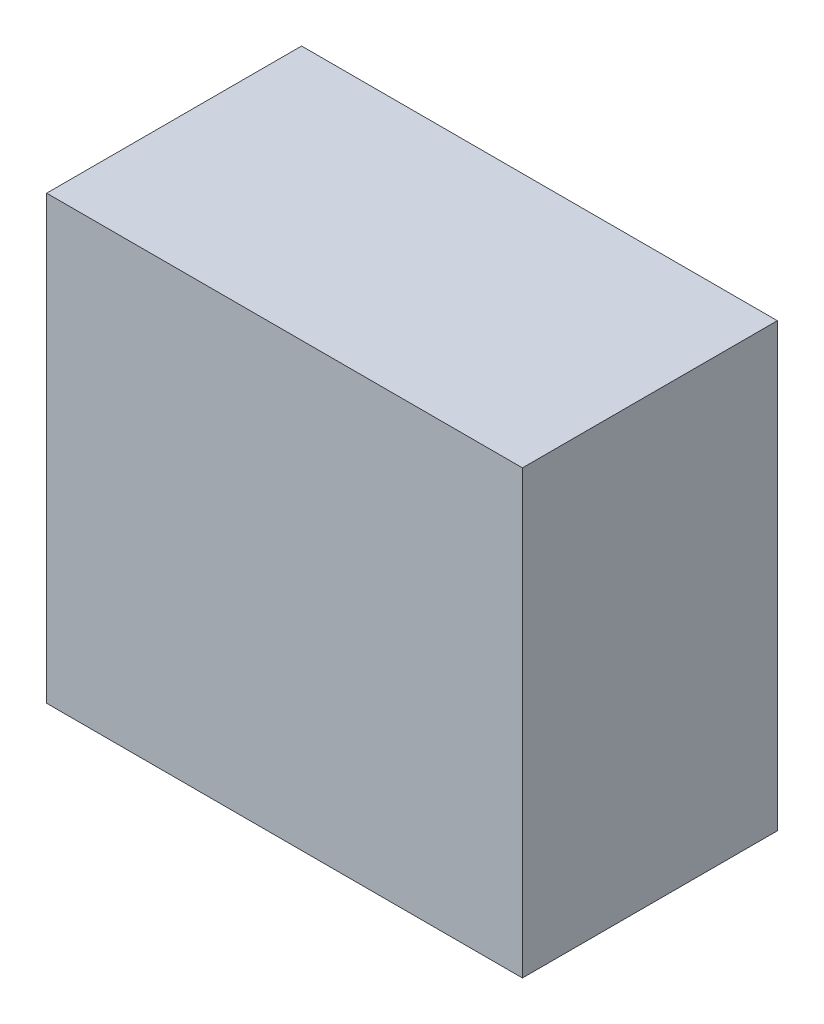
ISO-10303-21;
HEADER;
FILE_DESCRIPTION(('STEP AP214'),'2;1');
FILE_NAME('part.step','',(''),(''),'','','');
FILE_SCHEMA(('AUTOMOTIVE_DESIGN { 1 0 10303 214 1 1 1 1 }'));
ENDSEC;
DATA;
#1=APPLICATION_CONTEXT('core data for automotive mechanical design processes');
#2=APPLICATION_PROTOCOL_DEFINITION('international standard','automotive_design',2000,#1);
#3=PRODUCT_CONTEXT('',#1,'mechanical');
#4=PRODUCT('Part','Part','',(#3));
#5=PRODUCT_RELATED_PRODUCT_CATEGORY('part','',(#4));
#6=PRODUCT_DEFINITION_FORMATION('','',#4);
#7=PRODUCT_DEFINITION_CONTEXT('part definition',#1,'design');
#8=PRODUCT_DEFINITION('design','',#6,#7);
#9=PRODUCT_DEFINITION_SHAPE('','',#8);
#10=(LENGTH_UNIT() NAMED_UNIT(*) SI_UNIT(.MILLI.,.METRE.));
#11=(NAMED_UNIT(*) PLANE_ANGLE_UNIT() SI_UNIT($,.RADIAN.));
#12=(NAMED_UNIT(*) SI_UNIT($,.STERADIAN.) SOLID_ANGLE_UNIT());
#13=UNCERTAINTY_MEASURE_WITH_UNIT(LENGTH_MEASURE(1.E-05),#10,'distance_accuracy_value','');
#14=(GEOMETRIC_REPRESENTATION_CONTEXT(3) GLOBAL_UNCERTAINTY_ASSIGNED_CONTEXT((#13)) GLOBAL_UNIT_ASSIGNED_CONTEXT((#10,
#11,#12)) REPRESENTATION_CONTEXT('',''));
#15=CARTESIAN_POINT('',(0.,0.,0.));
#16=DIRECTION('',(0.,0.,1.));
#17=DIRECTION('',(1.,0.,0.));
#18=AXIS2_PLACEMENT_3D('',#15,#16,#17);
#19=CARTESIAN_POINT('',(6.99949324,-6.4994917,7.5));
#20=DIRECTION('',(0.,0.,-1.));
#21=DIRECTION('',(-1.,0.,0.));
#22=AXIS2_PLACEMENT_3D('',#19,#20,#21);
#23=PLANE('',#22);
#24=DIRECTION('',(1.,0.,0.));
#25=VECTOR('',#24,1.);
#26=CARTESIAN_POINT('',(6.99949324,6.4994917,7.5));
#27=LINE('',#26,#25);
#28=CARTESIAN_POINT('',(6.99949324,6.4994917,7.5));
#29=VERTEX_POINT('',#28);
#30=CARTESIAN_POINT('',(-6.9994907,6.4994917,7.5));
#31=VERTEX_POINT('',#30);
#32=EDGE_CURVE('E79',#29,#31,#27,.F.);
#33=ORIENTED_EDGE('',*,*,#32,.T.);
#34=DIRECTION('',(0.,1.,0.));
#35=VECTOR('',#34,1.);
#36=CARTESIAN_POINT('',(-6.9994907,6.4994917,7.5));
#37=LINE('',#36,#35);
#38=CARTESIAN_POINT('',(-6.9994907,-6.4994917,7.5));
#39=VERTEX_POINT('',#38);
#40=EDGE_CURVE('E55',#31,#39,#37,.F.);
#41=ORIENTED_EDGE('',*,*,#40,.T.);
#42=DIRECTION('',(1.,0.,0.));
#43=VECTOR('',#42,1.);
#44=CARTESIAN_POINT('',(-6.9994907,-6.4994917,7.5));
#45=LINE('',#44,#43);
#46=CARTESIAN_POINT('',(6.99949324,-6.4994917,7.5));
#47=VERTEX_POINT('',#46);
#48=EDGE_CURVE('E57',#39,#47,#45,.T.);
#49=ORIENTED_EDGE('',*,*,#48,.T.);
#50=DIRECTION('',(0.,1.,0.));
#51=VECTOR('',#50,1.);
#52=CARTESIAN_POINT('',(6.99949324,-6.4994917,7.5));
#53=LINE('',#52,#51);
#54=EDGE_CURVE('E20',#47,#29,#53,.T.);
#55=ORIENTED_EDGE('',*,*,#54,.T.);
#56=EDGE_LOOP('',(#33,#41,#49,#55));
#57=FACE_BOUND('',#56,.T.);
#58=ADVANCED_FACE('F17',(#57),#23,.F.);
#59=CARTESIAN_POINT('',(6.99949324,-6.4994917,0.));
#60=DIRECTION('',(-1.,0.,0.));
#61=DIRECTION('',(0.,0.,1.));
#62=AXIS2_PLACEMENT_3D('',#59,#60,#61);
#63=PLANE('',#62);
#64=DIRECTION('',(0.,1.,0.));
#65=VECTOR('',#64,1.);
#66=CARTESIAN_POINT('',(6.99949324,-6.4994917,0.));
#67=LINE('',#66,#65);
#68=CARTESIAN_POINT('',(6.99949324,6.4994917,0.));
#69=VERTEX_POINT('',#68);
#70=CARTESIAN_POINT('',(6.99949324,-6.4994917,0.));
#71=VERTEX_POINT('',#70);
#72=EDGE_CURVE('E83',#69,#71,#67,.F.);
#73=ORIENTED_EDGE('',*,*,#72,.F.);
#74=DIRECTION('',(0.,0.,-1.));
#75=VECTOR('',#74,1.);
#76=CARTESIAN_POINT('',(6.99949324,6.4994917,0.));
#77=LINE('',#76,#75);
#78=EDGE_CURVE('E68',#69,#29,#77,.F.);
#79=ORIENTED_EDGE('',*,*,#78,.T.);
#80=ORIENTED_EDGE('',*,*,#54,.F.);
#81=DIRECTION('',(0.,0.,1.));
#82=VECTOR('',#81,1.);
#83=CARTESIAN_POINT('',(6.99949324,-6.4994917,0.));
#84=LINE('',#83,#82);
#85=EDGE_CURVE('E63',#47,#71,#84,.F.);
#86=ORIENTED_EDGE('',*,*,#85,.T.);
#87=EDGE_LOOP('',(#73,#79,#80,#86));
#88=FACE_BOUND('',#87,.T.);
#89=ADVANCED_FACE('F65',(#88),#63,.F.);
#90=CARTESIAN_POINT('',(-6.9994907,-6.4994917,0.));
#91=DIRECTION('',(0.,1.,0.));
#92=DIRECTION('',(0.,0.,1.));
#93=AXIS2_PLACEMENT_3D('',#90,#91,#92);
#94=PLANE('',#93);
#95=DIRECTION('',(-1.,0.,0.));
#96=VECTOR('',#95,1.);
#97=CARTESIAN_POINT('',(6.99949324,-6.4994917,0.));
#98=LINE('',#97,#96);
#99=CARTESIAN_POINT('',(-6.9994907,-6.4994917,0.));
#100=VERTEX_POINT('',#99);
#101=EDGE_CURVE('E72',#71,#100,#98,.T.);
#102=ORIENTED_EDGE('',*,*,#101,.F.);
#103=ORIENTED_EDGE('',*,*,#85,.F.);
#104=ORIENTED_EDGE('',*,*,#48,.F.);
#105=DIRECTION('',(0.,0.,-1.));
#106=VECTOR('',#105,1.);
#107=CARTESIAN_POINT('',(-6.9994907,-6.4994917,0.));
#108=LINE('',#107,#106);
#109=EDGE_CURVE('E75',#39,#100,#108,.T.);
#110=ORIENTED_EDGE('',*,*,#109,.T.);
#111=EDGE_LOOP('',(#102,#103,#104,#110));
#112=FACE_BOUND('',#111,.T.);
#113=ADVANCED_FACE('F70',(#112),#94,.F.);
#114=CARTESIAN_POINT('',(-6.9994907,6.4994917,0.));
#115=DIRECTION('',(1.,0.,0.));
#116=DIRECTION('',(0.,0.,-1.));
#117=AXIS2_PLACEMENT_3D('',#114,#115,#116);
#118=PLANE('',#117);
#119=DIRECTION('',(0.,1.,0.));
#120=VECTOR('',#119,1.);
#121=CARTESIAN_POINT('',(-6.9994907,-6.4994917,0.));
#122=LINE('',#121,#120);
#123=CARTESIAN_POINT('',(-6.9994907,6.4994917,0.));
#124=VERTEX_POINT('',#123);
#125=EDGE_CURVE('E26',#100,#124,#122,.T.);
#126=ORIENTED_EDGE('',*,*,#125,.F.);
#127=ORIENTED_EDGE('',*,*,#109,.F.);
#128=ORIENTED_EDGE('',*,*,#40,.F.);
#129=DIRECTION('',(0.,0.,-1.));
#130=VECTOR('',#129,1.);
#131=CARTESIAN_POINT('',(-6.9994907,6.4994917,0.));
#132=LINE('',#131,#130);
#133=EDGE_CURVE('E35',#31,#124,#132,.T.);
#134=ORIENTED_EDGE('',*,*,#133,.T.);
#135=EDGE_LOOP('',(#126,#127,#128,#134));
#136=FACE_BOUND('',#135,.T.);
#137=ADVANCED_FACE('F89',(#136),#118,.F.);
#138=CARTESIAN_POINT('',(6.99949324,6.4994917,0.));
#139=DIRECTION('',(0.,-1.,0.));
#140=DIRECTION('',(0.,0.,-1.));
#141=AXIS2_PLACEMENT_3D('',#138,#139,#140);
#142=PLANE('',#141);
#143=DIRECTION('',(-1.,0.,0.));
#144=VECTOR('',#143,1.);
#145=CARTESIAN_POINT('',(6.99949324,6.4994917,0.));
#146=LINE('',#145,#144);
#147=EDGE_CURVE('E11',#124,#69,#146,.F.);
#148=ORIENTED_EDGE('',*,*,#147,.F.);
#149=ORIENTED_EDGE('',*,*,#133,.F.);
#150=ORIENTED_EDGE('',*,*,#32,.F.);
#151=ORIENTED_EDGE('',*,*,#78,.F.);
#152=EDGE_LOOP('',(#148,#149,#150,#151));
#153=FACE_BOUND('',#152,.T.);
#154=ADVANCED_FACE('F91',(#153),#142,.F.);
#155=CARTESIAN_POINT('',(6.99949324,-6.4994917,0.));
#156=DIRECTION('',(0.,0.,-1.));
#157=DIRECTION('',(-1.,0.,0.));
#158=AXIS2_PLACEMENT_3D('',#155,#156,#157);
#159=PLANE('',#158);
#160=ORIENTED_EDGE('',*,*,#125,.T.);
#161=ORIENTED_EDGE('',*,*,#147,.T.);
#162=ORIENTED_EDGE('',*,*,#72,.T.);
#163=ORIENTED_EDGE('',*,*,#101,.T.);
#164=EDGE_LOOP('',(#160,#161,#162,#163));
#165=FACE_BOUND('',#164,.T.);
#166=ADVANCED_FACE('F88',(#165),#159,.T.);
#167=CLOSED_SHELL('',(#58,#89,#113,#137,#154,#166));
#168=MANIFOLD_SOLID_BREP('B1',#167);
#169=ADVANCED_BREP_SHAPE_REPRESENTATION('',(#18,#168),#14);
#170=SHAPE_DEFINITION_REPRESENTATION(#9,#169);
ENDSEC;
END-ISO-10303-21;
